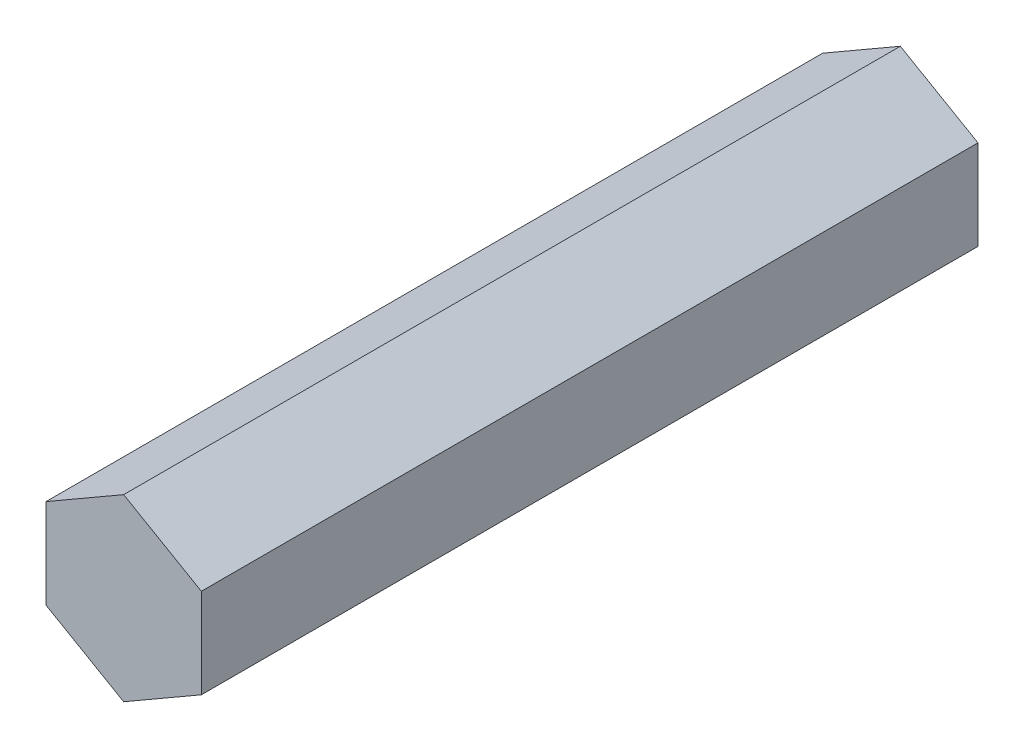
ISO-10303-21;
HEADER;
FILE_DESCRIPTION(('STEP AP214'),'2;1');
FILE_NAME('part.step','',(''),(''),'','','');
FILE_SCHEMA(('AUTOMOTIVE_DESIGN { 1 0 10303 214 1 1 1 1 }'));
ENDSEC;
DATA;
#1=APPLICATION_CONTEXT('core data for automotive mechanical design processes');
#2=APPLICATION_PROTOCOL_DEFINITION('international standard','automotive_design',2000,#1);
#3=PRODUCT_CONTEXT('',#1,'mechanical');
#4=PRODUCT('Part','Part','',(#3));
#5=PRODUCT_RELATED_PRODUCT_CATEGORY('part','',(#4));
#6=PRODUCT_DEFINITION_FORMATION('','',#4);
#7=PRODUCT_DEFINITION_CONTEXT('part definition',#1,'design');
#8=PRODUCT_DEFINITION('design','',#6,#7);
#9=PRODUCT_DEFINITION_SHAPE('','',#8);
#10=(LENGTH_UNIT() NAMED_UNIT(*) SI_UNIT(.MILLI.,.METRE.));
#11=(NAMED_UNIT(*) PLANE_ANGLE_UNIT() SI_UNIT($,.RADIAN.));
#12=(NAMED_UNIT(*) SI_UNIT($,.STERADIAN.) SOLID_ANGLE_UNIT());
#13=UNCERTAINTY_MEASURE_WITH_UNIT(LENGTH_MEASURE(1.E-05),#10,'distance_accuracy_value','');
#14=(GEOMETRIC_REPRESENTATION_CONTEXT(3) GLOBAL_UNCERTAINTY_ASSIGNED_CONTEXT((#13)) GLOBAL_UNIT_ASSIGNED_CONTEXT((#10,
#11,#12)) REPRESENTATION_CONTEXT('',''));
#15=CARTESIAN_POINT('',(0.,0.,0.));
#16=DIRECTION('',(0.,0.,1.));
#17=DIRECTION('',(1.,0.,0.));
#18=AXIS2_PLACEMENT_3D('',#15,#16,#17);
#19=CARTESIAN_POINT('',(0.,7.33234841870825,63.5));
#20=DIRECTION('',(0.5,-0.866025403784439,0.));
#21=DIRECTION('',(0.866025403784439,0.5,0.));
#22=AXIS2_PLACEMENT_3D('',#19,#20,#21);
#23=PLANE('',#22);
#24=DIRECTION('',(-0.866025403784439,-0.5,0.));
#25=VECTOR('',#24,1.);
#26=CARTESIAN_POINT('',(0.,7.33234841870825,0.));
#27=LINE('',#26,#25);
#28=CARTESIAN_POINT('',(0.,7.33234841870825,0.));
#29=VERTEX_POINT('',#28);
#30=CARTESIAN_POINT('',(-6.35,3.66617420935413,0.));
#31=VERTEX_POINT('',#30);
#32=EDGE_CURVE('E128',#29,#31,#27,.T.);
#33=ORIENTED_EDGE('',*,*,#32,.T.);
#34=DIRECTION('',(0.,0.,-1.));
#35=VECTOR('',#34,1.);
#36=CARTESIAN_POINT('',(-6.35,3.66617420935413,63.5));
#37=LINE('',#36,#35);
#38=CARTESIAN_POINT('',(-6.35,3.66617420935413,63.5));
#39=VERTEX_POINT('',#38);
#40=EDGE_CURVE('E11',#39,#31,#37,.T.);
#41=ORIENTED_EDGE('',*,*,#40,.F.);
#42=DIRECTION('',(-0.866025403784439,-0.5,0.));
#43=VECTOR('',#42,1.);
#44=CARTESIAN_POINT('',(0.,7.33234841870825,63.5));
#45=LINE('',#44,#43);
#46=CARTESIAN_POINT('',(0.,7.33234841870825,63.5));
#47=VERTEX_POINT('',#46);
#48=EDGE_CURVE('E138',#47,#39,#45,.T.);
#49=ORIENTED_EDGE('',*,*,#48,.F.);
#50=DIRECTION('',(0.,0.,-1.));
#51=VECTOR('',#50,1.);
#52=CARTESIAN_POINT('',(0.,7.33234841870825,63.5));
#53=LINE('',#52,#51);
#54=EDGE_CURVE('E124',#47,#29,#53,.T.);
#55=ORIENTED_EDGE('',*,*,#54,.T.);
#56=EDGE_LOOP('',(#33,#41,#49,#55));
#57=FACE_BOUND('',#56,.T.);
#58=ADVANCED_FACE('F44',(#57),#23,.F.);
#59=CARTESIAN_POINT('',(-6.35,3.66617420935413,63.5));
#60=DIRECTION('',(1.,0.,0.));
#61=DIRECTION('',(0.,1.,0.));
#62=AXIS2_PLACEMENT_3D('',#59,#60,#61);
#63=PLANE('',#62);
#64=DIRECTION('',(0.,-1.,0.));
#65=VECTOR('',#64,1.);
#66=CARTESIAN_POINT('',(-6.35,3.66617420935413,0.));
#67=LINE('',#66,#65);
#68=CARTESIAN_POINT('',(-6.35,-3.66617420935412,0.));
#69=VERTEX_POINT('',#68);
#70=EDGE_CURVE('E131',#31,#69,#67,.T.);
#71=ORIENTED_EDGE('',*,*,#70,.T.);
#72=DIRECTION('',(0.,0.,-1.));
#73=VECTOR('',#72,1.);
#74=CARTESIAN_POINT('',(-6.35,-3.66617420935412,63.5));
#75=LINE('',#74,#73);
#76=CARTESIAN_POINT('',(-6.35,-3.66617420935412,63.5));
#77=VERTEX_POINT('',#76);
#78=EDGE_CURVE('E52',#77,#69,#75,.T.);
#79=ORIENTED_EDGE('',*,*,#78,.F.);
#80=DIRECTION('',(0.,-1.,0.));
#81=VECTOR('',#80,1.);
#82=CARTESIAN_POINT('',(-6.35,3.66617420935413,63.5));
#83=LINE('',#82,#81);
#84=EDGE_CURVE('E97',#39,#77,#83,.T.);
#85=ORIENTED_EDGE('',*,*,#84,.F.);
#86=ORIENTED_EDGE('',*,*,#40,.T.);
#87=EDGE_LOOP('',(#71,#79,#85,#86));
#88=FACE_BOUND('',#87,.T.);
#89=ADVANCED_FACE('F162',(#88),#63,.F.);
#90=CARTESIAN_POINT('',(-6.35,-3.66617420935412,63.5));
#91=DIRECTION('',(0.5,0.866025403784439,0.));
#92=DIRECTION('',(-0.866025403784439,0.5,0.));
#93=AXIS2_PLACEMENT_3D('',#90,#91,#92);
#94=PLANE('',#93);
#95=DIRECTION('',(0.866025403784438,-0.5,0.));
#96=VECTOR('',#95,1.);
#97=CARTESIAN_POINT('',(-6.35,-3.66617420935412,0.));
#98=LINE('',#97,#96);
#99=CARTESIAN_POINT('',(0.,-7.33234841870825,0.));
#100=VERTEX_POINT('',#99);
#101=EDGE_CURVE('E133',#69,#100,#98,.T.);
#102=ORIENTED_EDGE('',*,*,#101,.T.);
#103=DIRECTION('',(0.,0.,-1.));
#104=VECTOR('',#103,1.);
#105=CARTESIAN_POINT('',(0.,-7.33234841870825,63.5));
#106=LINE('',#105,#104);
#107=CARTESIAN_POINT('',(0.,-7.33234841870825,63.5));
#108=VERTEX_POINT('',#107);
#109=EDGE_CURVE('E119',#108,#100,#106,.T.);
#110=ORIENTED_EDGE('',*,*,#109,.F.);
#111=DIRECTION('',(0.866025403784438,-0.5,0.));
#112=VECTOR('',#111,1.);
#113=CARTESIAN_POINT('',(-6.35,-3.66617420935412,63.5));
#114=LINE('',#113,#112);
#115=EDGE_CURVE('E110',#77,#108,#114,.T.);
#116=ORIENTED_EDGE('',*,*,#115,.F.);
#117=ORIENTED_EDGE('',*,*,#78,.T.);
#118=EDGE_LOOP('',(#102,#110,#116,#117));
#119=FACE_BOUND('',#118,.T.);
#120=ADVANCED_FACE('F144',(#119),#94,.F.);
#121=CARTESIAN_POINT('',(0.,-7.33234841870825,63.5));
#122=DIRECTION('',(-0.5,0.866025403784439,0.));
#123=DIRECTION('',(-0.866025403784439,-0.5,0.));
#124=AXIS2_PLACEMENT_3D('',#121,#122,#123);
#125=PLANE('',#124);
#126=DIRECTION('',(0.866025403784439,0.5,0.));
#127=VECTOR('',#126,1.);
#128=CARTESIAN_POINT('',(0.,-7.33234841870825,0.));
#129=LINE('',#128,#127);
#130=CARTESIAN_POINT('',(6.35,-3.66617420935413,0.));
#131=VERTEX_POINT('',#130);
#132=EDGE_CURVE('E118',#100,#131,#129,.T.);
#133=ORIENTED_EDGE('',*,*,#132,.T.);
#134=DIRECTION('',(0.,0.,-1.));
#135=VECTOR('',#134,1.);
#136=CARTESIAN_POINT('',(6.35,-3.66617420935413,63.5));
#137=LINE('',#136,#135);
#138=CARTESIAN_POINT('',(6.35,-3.66617420935413,63.5));
#139=VERTEX_POINT('',#138);
#140=EDGE_CURVE('E115',#139,#131,#137,.T.);
#141=ORIENTED_EDGE('',*,*,#140,.F.);
#142=DIRECTION('',(0.866025403784439,0.5,0.));
#143=VECTOR('',#142,1.);
#144=CARTESIAN_POINT('',(0.,-7.33234841870825,63.5));
#145=LINE('',#144,#143);
#146=EDGE_CURVE('E104',#108,#139,#145,.T.);
#147=ORIENTED_EDGE('',*,*,#146,.F.);
#148=ORIENTED_EDGE('',*,*,#109,.T.);
#149=EDGE_LOOP('',(#133,#141,#147,#148));
#150=FACE_BOUND('',#149,.T.);
#151=ADVANCED_FACE('F116',(#150),#125,.F.);
#152=CARTESIAN_POINT('',(6.35,-3.66617420935413,63.5));
#153=DIRECTION('',(-1.,0.,0.));
#154=DIRECTION('',(0.,-1.,0.));
#155=AXIS2_PLACEMENT_3D('',#152,#153,#154);
#156=PLANE('',#155);
#157=DIRECTION('',(0.,1.,0.));
#158=VECTOR('',#157,1.);
#159=CARTESIAN_POINT('',(6.35,-3.66617420935413,0.));
#160=LINE('',#159,#158);
#161=CARTESIAN_POINT('',(6.35,3.66617420935412,0.));
#162=VERTEX_POINT('',#161);
#163=EDGE_CURVE('E83',#131,#162,#160,.T.);
#164=ORIENTED_EDGE('',*,*,#163,.T.);
#165=DIRECTION('',(0.,0.,-1.));
#166=VECTOR('',#165,1.);
#167=CARTESIAN_POINT('',(6.35,3.66617420935412,63.5));
#168=LINE('',#167,#166);
#169=CARTESIAN_POINT('',(6.35,3.66617420935412,63.5));
#170=VERTEX_POINT('',#169);
#171=EDGE_CURVE('E120',#170,#162,#168,.T.);
#172=ORIENTED_EDGE('',*,*,#171,.F.);
#173=DIRECTION('',(0.,1.,0.));
#174=VECTOR('',#173,1.);
#175=CARTESIAN_POINT('',(6.35,-3.66617420935413,63.5));
#176=LINE('',#175,#174);
#177=EDGE_CURVE('E108',#139,#170,#176,.T.);
#178=ORIENTED_EDGE('',*,*,#177,.F.);
#179=ORIENTED_EDGE('',*,*,#140,.T.);
#180=EDGE_LOOP('',(#164,#172,#178,#179));
#181=FACE_BOUND('',#180,.T.);
#182=ADVANCED_FACE('F122',(#181),#156,.F.);
#183=CARTESIAN_POINT('',(6.35,3.66617420935412,63.5));
#184=DIRECTION('',(-0.5,-0.866025403784438,0.));
#185=DIRECTION('',(0.866025403784439,-0.5,0.));
#186=AXIS2_PLACEMENT_3D('',#183,#184,#185);
#187=PLANE('',#186);
#188=DIRECTION('',(-0.866025403784438,0.5,0.));
#189=VECTOR('',#188,1.);
#190=CARTESIAN_POINT('',(6.35,3.66617420935412,0.));
#191=LINE('',#190,#189);
#192=EDGE_CURVE('E89',#162,#29,#191,.T.);
#193=ORIENTED_EDGE('',*,*,#192,.T.);
#194=ORIENTED_EDGE('',*,*,#54,.F.);
#195=DIRECTION('',(-0.866025403784438,0.5,0.));
#196=VECTOR('',#195,1.);
#197=CARTESIAN_POINT('',(6.35,3.66617420935412,63.5));
#198=LINE('',#197,#196);
#199=EDGE_CURVE('E60',#170,#47,#198,.T.);
#200=ORIENTED_EDGE('',*,*,#199,.F.);
#201=ORIENTED_EDGE('',*,*,#171,.T.);
#202=EDGE_LOOP('',(#193,#194,#200,#201));
#203=FACE_BOUND('',#202,.T.);
#204=ADVANCED_FACE('F151',(#203),#187,.F.);
#205=CARTESIAN_POINT('',(0.,0.,63.5));
#206=DIRECTION('',(0.,0.,1.));
#207=DIRECTION('',(1.,0.,0.));
#208=AXIS2_PLACEMENT_3D('',#205,#206,#207);
#209=PLANE('',#208);
#210=ORIENTED_EDGE('',*,*,#48,.T.);
#211=ORIENTED_EDGE('',*,*,#84,.T.);
#212=ORIENTED_EDGE('',*,*,#115,.T.);
#213=ORIENTED_EDGE('',*,*,#146,.T.);
#214=ORIENTED_EDGE('',*,*,#177,.T.);
#215=ORIENTED_EDGE('',*,*,#199,.T.);
#216=EDGE_LOOP('',(#210,#211,#212,#213,#214,#215));
#217=FACE_BOUND('',#216,.T.);
#218=ADVANCED_FACE('F106',(#217),#209,.T.);
#219=CARTESIAN_POINT('',(0.,0.,0.));
#220=DIRECTION('',(0.,0.,1.));
#221=DIRECTION('',(1.,0.,0.));
#222=AXIS2_PLACEMENT_3D('',#219,#220,#221);
#223=PLANE('',#222);
#224=ORIENTED_EDGE('',*,*,#32,.F.);
#225=ORIENTED_EDGE('',*,*,#192,.F.);
#226=ORIENTED_EDGE('',*,*,#163,.F.);
#227=ORIENTED_EDGE('',*,*,#132,.F.);
#228=ORIENTED_EDGE('',*,*,#101,.F.);
#229=ORIENTED_EDGE('',*,*,#70,.F.);
#230=EDGE_LOOP('',(#224,#225,#226,#227,#228,#229));
#231=FACE_BOUND('',#230,.T.);
#232=ADVANCED_FACE('F147',(#231),#223,.F.);
#233=CLOSED_SHELL('',(#58,#89,#120,#151,#182,#204,#218,#232));
#234=MANIFOLD_SOLID_BREP('B2',#233);
#235=ADVANCED_BREP_SHAPE_REPRESENTATION('',(#18,#234),#14);
#236=SHAPE_DEFINITION_REPRESENTATION(#9,#235);
ENDSEC;
END-ISO-10303-21;
